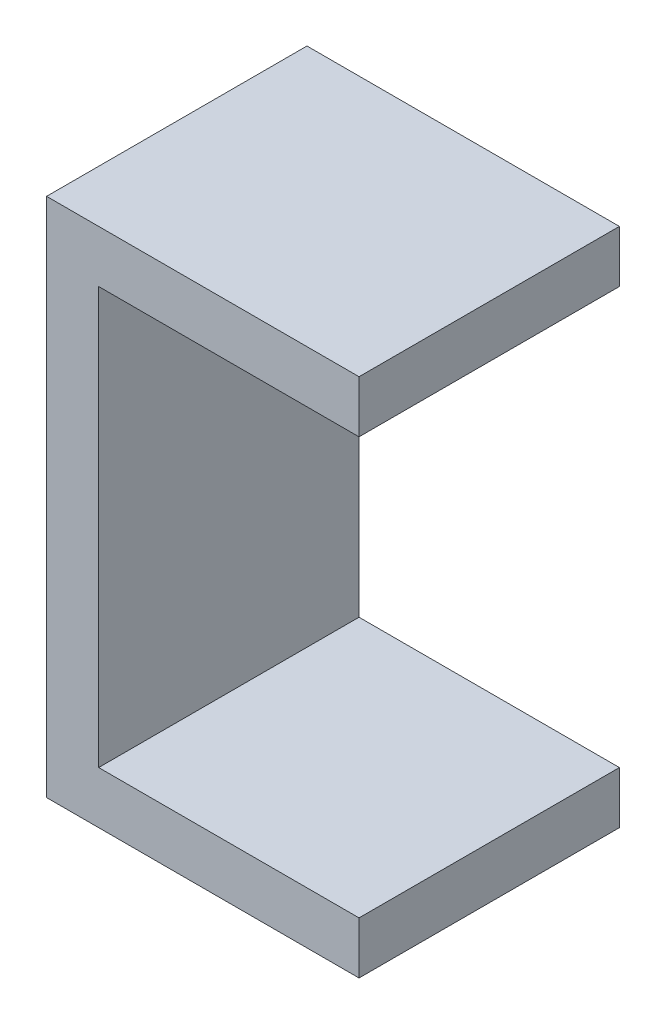
ISO-10303-21;
HEADER;
FILE_DESCRIPTION(('STEP AP214'),'2;1');
FILE_NAME('part.step','',(''),(''),'','','');
FILE_SCHEMA(('AUTOMOTIVE_DESIGN { 1 0 10303 214 1 1 1 1 }'));
ENDSEC;
DATA;
#1=APPLICATION_CONTEXT('core data for automotive mechanical design processes');
#2=APPLICATION_PROTOCOL_DEFINITION('international standard','automotive_design',2000,#1);
#3=PRODUCT_CONTEXT('',#1,'mechanical');
#4=PRODUCT('Part','Part','',(#3));
#5=PRODUCT_RELATED_PRODUCT_CATEGORY('part','',(#4));
#6=PRODUCT_DEFINITION_FORMATION('','',#4);
#7=PRODUCT_DEFINITION_CONTEXT('part definition',#1,'design');
#8=PRODUCT_DEFINITION('design','',#6,#7);
#9=PRODUCT_DEFINITION_SHAPE('','',#8);
#10=(LENGTH_UNIT() NAMED_UNIT(*) SI_UNIT(.MILLI.,.METRE.));
#11=(NAMED_UNIT(*) PLANE_ANGLE_UNIT() SI_UNIT($,.RADIAN.));
#12=(NAMED_UNIT(*) SI_UNIT($,.STERADIAN.) SOLID_ANGLE_UNIT());
#13=UNCERTAINTY_MEASURE_WITH_UNIT(LENGTH_MEASURE(1.E-05),#10,'distance_accuracy_value','');
#14=(GEOMETRIC_REPRESENTATION_CONTEXT(3) GLOBAL_UNCERTAINTY_ASSIGNED_CONTEXT((#13)) GLOBAL_UNIT_ASSIGNED_CONTEXT((#10,
#11,#12)) REPRESENTATION_CONTEXT('',''));
#15=CARTESIAN_POINT('',(0.,0.,0.));
#16=DIRECTION('',(0.,0.,1.));
#17=DIRECTION('',(1.,0.,0.));
#18=AXIS2_PLACEMENT_3D('',#15,#16,#17);
#19=CARTESIAN_POINT('',(0.,-10.,10.));
#20=DIRECTION('',(0.,1.,0.));
#21=DIRECTION('',(0.,0.,1.));
#22=AXIS2_PLACEMENT_3D('',#19,#20,#21);
#23=PLANE('',#22);
#24=DIRECTION('',(1.,0.,0.));
#25=VECTOR('',#24,1.);
#26=CARTESIAN_POINT('',(0.,-10.,0.));
#27=LINE('',#26,#25);
#28=CARTESIAN_POINT('',(0.,-10.,0.));
#29=VERTEX_POINT('',#28);
#30=CARTESIAN_POINT('',(12.,-10.,0.));
#31=VERTEX_POINT('',#30);
#32=EDGE_CURVE('E133',#29,#31,#27,.T.);
#33=ORIENTED_EDGE('',*,*,#32,.T.);
#34=DIRECTION('',(0.,0.,-1.));
#35=VECTOR('',#34,1.);
#36=CARTESIAN_POINT('',(12.,-10.,10.));
#37=LINE('',#36,#35);
#38=CARTESIAN_POINT('',(12.,-10.,10.));
#39=VERTEX_POINT('',#38);
#40=EDGE_CURVE('E11',#39,#31,#37,.T.);
#41=ORIENTED_EDGE('',*,*,#40,.F.);
#42=DIRECTION('',(1.,0.,0.));
#43=VECTOR('',#42,1.);
#44=CARTESIAN_POINT('',(0.,-10.,10.));
#45=LINE('',#44,#43);
#46=CARTESIAN_POINT('',(0.,-10.,10.));
#47=VERTEX_POINT('',#46);
#48=EDGE_CURVE('E147',#47,#39,#45,.T.);
#49=ORIENTED_EDGE('',*,*,#48,.F.);
#50=DIRECTION('',(0.,0.,-1.));
#51=VECTOR('',#50,1.);
#52=CARTESIAN_POINT('',(0.,-10.,10.));
#53=LINE('',#52,#51);
#54=EDGE_CURVE('E129',#47,#29,#53,.T.);
#55=ORIENTED_EDGE('',*,*,#54,.T.);
#56=EDGE_LOOP('',(#33,#41,#49,#55));
#57=FACE_BOUND('',#56,.T.);
#58=ADVANCED_FACE('F37',(#57),#23,.F.);
#59=CARTESIAN_POINT('',(12.,-10.,10.));
#60=DIRECTION('',(-1.,0.,0.));
#61=DIRECTION('',(0.,-1.,0.));
#62=AXIS2_PLACEMENT_3D('',#59,#60,#61);
#63=PLANE('',#62);
#64=DIRECTION('',(0.,1.,0.));
#65=VECTOR('',#64,1.);
#66=CARTESIAN_POINT('',(12.,-10.,0.));
#67=LINE('',#66,#65);
#68=CARTESIAN_POINT('',(12.,-8.,0.));
#69=VERTEX_POINT('',#68);
#70=EDGE_CURVE('E136',#31,#69,#67,.T.);
#71=ORIENTED_EDGE('',*,*,#70,.T.);
#72=DIRECTION('',(0.,0.,-1.));
#73=VECTOR('',#72,1.);
#74=CARTESIAN_POINT('',(12.,-8.,10.));
#75=LINE('',#74,#73);
#76=CARTESIAN_POINT('',(12.,-8.,10.));
#77=VERTEX_POINT('',#76);
#78=EDGE_CURVE('E45',#77,#69,#75,.T.);
#79=ORIENTED_EDGE('',*,*,#78,.F.);
#80=DIRECTION('',(0.,1.,0.));
#81=VECTOR('',#80,1.);
#82=CARTESIAN_POINT('',(12.,-10.,10.));
#83=LINE('',#82,#81);
#84=EDGE_CURVE('E96',#39,#77,#83,.T.);
#85=ORIENTED_EDGE('',*,*,#84,.F.);
#86=ORIENTED_EDGE('',*,*,#40,.T.);
#87=EDGE_LOOP('',(#71,#79,#85,#86));
#88=FACE_BOUND('',#87,.T.);
#89=ADVANCED_FACE('F182',(#88),#63,.F.);
#90=CARTESIAN_POINT('',(12.,-8.,10.));
#91=DIRECTION('',(0.,-1.,0.));
#92=DIRECTION('',(1.,0.,0.));
#93=AXIS2_PLACEMENT_3D('',#90,#91,#92);
#94=PLANE('',#93);
#95=DIRECTION('',(-1.,0.,0.));
#96=VECTOR('',#95,1.);
#97=CARTESIAN_POINT('',(12.,-8.,0.));
#98=LINE('',#97,#96);
#99=CARTESIAN_POINT('',(2.,-8.,0.));
#100=VERTEX_POINT('',#99);
#101=EDGE_CURVE('E138',#69,#100,#98,.T.);
#102=ORIENTED_EDGE('',*,*,#101,.T.);
#103=DIRECTION('',(0.,0.,-1.));
#104=VECTOR('',#103,1.);
#105=CARTESIAN_POINT('',(2.,-8.,10.));
#106=LINE('',#105,#104);
#107=CARTESIAN_POINT('',(2.,-8.,10.));
#108=VERTEX_POINT('',#107);
#109=EDGE_CURVE('E154',#108,#100,#106,.T.);
#110=ORIENTED_EDGE('',*,*,#109,.F.);
#111=DIRECTION('',(-1.,0.,0.));
#112=VECTOR('',#111,1.);
#113=CARTESIAN_POINT('',(12.,-8.,10.));
#114=LINE('',#113,#112);
#115=EDGE_CURVE('E162',#77,#108,#114,.T.);
#116=ORIENTED_EDGE('',*,*,#115,.F.);
#117=ORIENTED_EDGE('',*,*,#78,.T.);
#118=EDGE_LOOP('',(#102,#110,#116,#117));
#119=FACE_BOUND('',#118,.T.);
#120=ADVANCED_FACE('F160',(#119),#94,.F.);
#121=CARTESIAN_POINT('',(2.,-8.,10.));
#122=DIRECTION('',(-1.,0.,0.));
#123=DIRECTION('',(0.,0.,1.));
#124=AXIS2_PLACEMENT_3D('',#121,#122,#123);
#125=PLANE('',#124);
#126=DIRECTION('',(0.,1.,0.));
#127=VECTOR('',#126,1.);
#128=CARTESIAN_POINT('',(2.,-8.,0.));
#129=LINE('',#128,#127);
#130=CARTESIAN_POINT('',(2.,8.,0.));
#131=VERTEX_POINT('',#130);
#132=EDGE_CURVE('E140',#100,#131,#129,.T.);
#133=ORIENTED_EDGE('',*,*,#132,.T.);
#134=DIRECTION('',(0.,0.,-1.));
#135=VECTOR('',#134,1.);
#136=CARTESIAN_POINT('',(2.,8.,10.));
#137=LINE('',#136,#135);
#138=CARTESIAN_POINT('',(2.,8.,10.));
#139=VERTEX_POINT('',#138);
#140=EDGE_CURVE('E151',#139,#131,#137,.T.);
#141=ORIENTED_EDGE('',*,*,#140,.F.);
#142=DIRECTION('',(0.,1.,0.));
#143=VECTOR('',#142,1.);
#144=CARTESIAN_POINT('',(2.,-8.,10.));
#145=LINE('',#144,#143);
#146=EDGE_CURVE('E174',#108,#139,#145,.T.);
#147=ORIENTED_EDGE('',*,*,#146,.F.);
#148=ORIENTED_EDGE('',*,*,#109,.T.);
#149=EDGE_LOOP('',(#133,#141,#147,#148));
#150=FACE_BOUND('',#149,.T.);
#151=ADVANCED_FACE('F170',(#150),#125,.F.);
#152=CARTESIAN_POINT('',(12.,8.,10.));
#153=DIRECTION('',(0.,1.,0.));
#154=DIRECTION('',(-1.,0.,0.));
#155=AXIS2_PLACEMENT_3D('',#152,#153,#154);
#156=PLANE('',#155);
#157=DIRECTION('',(1.,0.,0.));
#158=VECTOR('',#157,1.);
#159=CARTESIAN_POINT('',(12.,8.,0.));
#160=LINE('',#159,#158);
#161=CARTESIAN_POINT('',(12.,8.,0.));
#162=VERTEX_POINT('',#161);
#163=EDGE_CURVE('E142',#131,#162,#160,.T.);
#164=ORIENTED_EDGE('',*,*,#163,.T.);
#165=DIRECTION('',(0.,0.,-1.));
#166=VECTOR('',#165,1.);
#167=CARTESIAN_POINT('',(12.,8.,10.));
#168=LINE('',#167,#166);
#169=CARTESIAN_POINT('',(12.,8.,10.));
#170=VERTEX_POINT('',#169);
#171=EDGE_CURVE('E124',#170,#162,#168,.T.);
#172=ORIENTED_EDGE('',*,*,#171,.F.);
#173=DIRECTION('',(1.,0.,0.));
#174=VECTOR('',#173,1.);
#175=CARTESIAN_POINT('',(12.,8.,10.));
#176=LINE('',#175,#174);
#177=EDGE_CURVE('E115',#139,#170,#176,.T.);
#178=ORIENTED_EDGE('',*,*,#177,.F.);
#179=ORIENTED_EDGE('',*,*,#140,.T.);
#180=EDGE_LOOP('',(#164,#172,#178,#179));
#181=FACE_BOUND('',#180,.T.);
#182=ADVANCED_FACE('F173',(#181),#156,.F.);
#183=CARTESIAN_POINT('',(12.,10.,10.));
#184=DIRECTION('',(-1.,0.,0.));
#185=DIRECTION('',(0.,-1.,0.));
#186=AXIS2_PLACEMENT_3D('',#183,#184,#185);
#187=PLANE('',#186);
#188=DIRECTION('',(0.,1.,0.));
#189=VECTOR('',#188,1.);
#190=CARTESIAN_POINT('',(12.,10.,0.));
#191=LINE('',#190,#189);
#192=CARTESIAN_POINT('',(12.,10.,0.));
#193=VERTEX_POINT('',#192);
#194=EDGE_CURVE('E123',#162,#193,#191,.T.);
#195=ORIENTED_EDGE('',*,*,#194,.T.);
#196=DIRECTION('',(0.,0.,-1.));
#197=VECTOR('',#196,1.);
#198=CARTESIAN_POINT('',(12.,10.,10.));
#199=LINE('',#198,#197);
#200=CARTESIAN_POINT('',(12.,10.,10.));
#201=VERTEX_POINT('',#200);
#202=EDGE_CURVE('E120',#201,#193,#199,.T.);
#203=ORIENTED_EDGE('',*,*,#202,.F.);
#204=DIRECTION('',(0.,1.,0.));
#205=VECTOR('',#204,1.);
#206=CARTESIAN_POINT('',(12.,10.,10.));
#207=LINE('',#206,#205);
#208=EDGE_CURVE('E109',#170,#201,#207,.T.);
#209=ORIENTED_EDGE('',*,*,#208,.F.);
#210=ORIENTED_EDGE('',*,*,#171,.T.);
#211=EDGE_LOOP('',(#195,#203,#209,#210));
#212=FACE_BOUND('',#211,.T.);
#213=ADVANCED_FACE('F121',(#212),#187,.F.);
#214=CARTESIAN_POINT('',(0.,10.,10.));
#215=DIRECTION('',(0.,-1.,0.));
#216=DIRECTION('',(0.,0.,-1.));
#217=AXIS2_PLACEMENT_3D('',#214,#215,#216);
#218=PLANE('',#217);
#219=DIRECTION('',(-1.,0.,0.));
#220=VECTOR('',#219,1.);
#221=CARTESIAN_POINT('',(0.,10.,0.));
#222=LINE('',#221,#220);
#223=CARTESIAN_POINT('',(0.,10.,0.));
#224=VERTEX_POINT('',#223);
#225=EDGE_CURVE('E82',#193,#224,#222,.T.);
#226=ORIENTED_EDGE('',*,*,#225,.T.);
#227=DIRECTION('',(0.,0.,-1.));
#228=VECTOR('',#227,1.);
#229=CARTESIAN_POINT('',(0.,10.,10.));
#230=LINE('',#229,#228);
#231=CARTESIAN_POINT('',(0.,10.,10.));
#232=VERTEX_POINT('',#231);
#233=EDGE_CURVE('E125',#232,#224,#230,.T.);
#234=ORIENTED_EDGE('',*,*,#233,.F.);
#235=DIRECTION('',(-1.,0.,0.));
#236=VECTOR('',#235,1.);
#237=CARTESIAN_POINT('',(0.,10.,10.));
#238=LINE('',#237,#236);
#239=EDGE_CURVE('E113',#201,#232,#238,.T.);
#240=ORIENTED_EDGE('',*,*,#239,.F.);
#241=ORIENTED_EDGE('',*,*,#202,.T.);
#242=EDGE_LOOP('',(#226,#234,#240,#241));
#243=FACE_BOUND('',#242,.T.);
#244=ADVANCED_FACE('F127',(#243),#218,.F.);
#245=CARTESIAN_POINT('',(0.,10.,10.));
#246=DIRECTION('',(1.,0.,0.));
#247=DIRECTION('',(0.,0.,-1.));
#248=AXIS2_PLACEMENT_3D('',#245,#246,#247);
#249=PLANE('',#248);
#250=DIRECTION('',(0.,-1.,0.));
#251=VECTOR('',#250,1.);
#252=CARTESIAN_POINT('',(0.,10.,0.));
#253=LINE('',#252,#251);
#254=EDGE_CURVE('E88',#224,#29,#253,.T.);
#255=ORIENTED_EDGE('',*,*,#254,.T.);
#256=ORIENTED_EDGE('',*,*,#54,.F.);
#257=DIRECTION('',(0.,-1.,0.));
#258=VECTOR('',#257,1.);
#259=CARTESIAN_POINT('',(0.,10.,10.));
#260=LINE('',#259,#258);
#261=EDGE_CURVE('E53',#232,#47,#260,.T.);
#262=ORIENTED_EDGE('',*,*,#261,.F.);
#263=ORIENTED_EDGE('',*,*,#233,.T.);
#264=EDGE_LOOP('',(#255,#256,#262,#263));
#265=FACE_BOUND('',#264,.T.);
#266=ADVANCED_FACE('F198',(#265),#249,.F.);
#267=CARTESIAN_POINT('',(0.,0.,10.));
#268=DIRECTION('',(0.,0.,1.));
#269=DIRECTION('',(1.,0.,0.));
#270=AXIS2_PLACEMENT_3D('',#267,#268,#269);
#271=PLANE('',#270);
#272=ORIENTED_EDGE('',*,*,#48,.T.);
#273=ORIENTED_EDGE('',*,*,#84,.T.);
#274=ORIENTED_EDGE('',*,*,#115,.T.);
#275=ORIENTED_EDGE('',*,*,#146,.T.);
#276=ORIENTED_EDGE('',*,*,#177,.T.);
#277=ORIENTED_EDGE('',*,*,#208,.T.);
#278=ORIENTED_EDGE('',*,*,#239,.T.);
#279=ORIENTED_EDGE('',*,*,#261,.T.);
#280=EDGE_LOOP('',(#272,#273,#274,#275,#276,#277,#278,#279));
#281=FACE_BOUND('',#280,.T.);
#282=ADVANCED_FACE('F111',(#281),#271,.T.);
#283=CARTESIAN_POINT('',(0.,0.,0.));
#284=DIRECTION('',(0.,0.,1.));
#285=DIRECTION('',(1.,0.,0.));
#286=AXIS2_PLACEMENT_3D('',#283,#284,#285);
#287=PLANE('',#286);
#288=ORIENTED_EDGE('',*,*,#32,.F.);
#289=ORIENTED_EDGE('',*,*,#254,.F.);
#290=ORIENTED_EDGE('',*,*,#225,.F.);
#291=ORIENTED_EDGE('',*,*,#194,.F.);
#292=ORIENTED_EDGE('',*,*,#163,.F.);
#293=ORIENTED_EDGE('',*,*,#132,.F.);
#294=ORIENTED_EDGE('',*,*,#101,.F.);
#295=ORIENTED_EDGE('',*,*,#70,.F.);
#296=EDGE_LOOP('',(#288,#289,#290,#291,#292,#293,#294,#295));
#297=FACE_BOUND('',#296,.T.);
#298=ADVANCED_FACE('F166',(#297),#287,.F.);
#299=CLOSED_SHELL('',(#58,#89,#120,#151,#182,#213,#244,#266,#282,#298));
#300=MANIFOLD_SOLID_BREP('B2',#299);
#301=ADVANCED_BREP_SHAPE_REPRESENTATION('',(#18,#300),#14);
#302=SHAPE_DEFINITION_REPRESENTATION(#9,#301);
ENDSEC;
END-ISO-10303-21;
